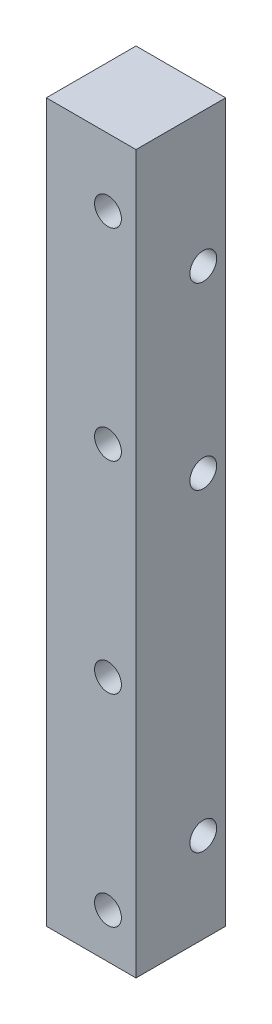
ISO-10303-21;
HEADER;
FILE_DESCRIPTION(('STEP AP214'),'2;1');
FILE_NAME('part.step','',(''),(''),'','','');
FILE_SCHEMA(('AUTOMOTIVE_DESIGN { 1 0 10303 214 1 1 1 1 }'));
ENDSEC;
DATA;
#1=APPLICATION_CONTEXT('core data for automotive mechanical design processes');
#2=APPLICATION_PROTOCOL_DEFINITION('international standard','automotive_design',2000,#1);
#3=PRODUCT_CONTEXT('',#1,'mechanical');
#4=PRODUCT('Part','Part','',(#3));
#5=PRODUCT_RELATED_PRODUCT_CATEGORY('part','',(#4));
#6=PRODUCT_DEFINITION_FORMATION('','',#4);
#7=PRODUCT_DEFINITION_CONTEXT('part definition',#1,'design');
#8=PRODUCT_DEFINITION('design','',#6,#7);
#9=PRODUCT_DEFINITION_SHAPE('','',#8);
#10=(LENGTH_UNIT() NAMED_UNIT(*) SI_UNIT(.MILLI.,.METRE.));
#11=(NAMED_UNIT(*) PLANE_ANGLE_UNIT() SI_UNIT($,.RADIAN.));
#12=(NAMED_UNIT(*) SI_UNIT($,.STERADIAN.) SOLID_ANGLE_UNIT());
#13=UNCERTAINTY_MEASURE_WITH_UNIT(LENGTH_MEASURE(1.E-05),#10,'distance_accuracy_value','');
#14=(GEOMETRIC_REPRESENTATION_CONTEXT(3) GLOBAL_UNCERTAINTY_ASSIGNED_CONTEXT((#13)) GLOBAL_UNIT_ASSIGNED_CONTEXT((#10,
#11,#12)) REPRESENTATION_CONTEXT('',''));
#15=CARTESIAN_POINT('',(0.,0.,0.));
#16=DIRECTION('',(0.,0.,1.));
#17=DIRECTION('',(1.,0.,0.));
#18=AXIS2_PLACEMENT_3D('',#15,#16,#17);
#19=CARTESIAN_POINT('',(6.35,101.6,-6.35));
#20=DIRECTION('',(-1.,0.,0.));
#21=DIRECTION('',(0.,0.,1.));
#22=AXIS2_PLACEMENT_3D('',#19,#20,#21);
#23=PLANE('',#22);
#24=CARTESIAN_POINT('',(6.35,12.7,-3.17500000000001));
#25=DIRECTION('',(1.,0.,0.));
#26=DIRECTION('',(0.,0.,-1.));
#27=AXIS2_PLACEMENT_3D('',#24,#25,#26);
#28=CIRCLE('',#27,1.89865);
#29=CARTESIAN_POINT('',(6.35,12.7,-5.07365000000001));
#30=VERTEX_POINT('',#29);
#31=EDGE_CURVE('E125',#30,#30,#28,.T.);
#32=ORIENTED_EDGE('',*,*,#31,.F.);
#33=EDGE_LOOP('',(#32));
#34=FACE_BOUND('',#33,.T.);
#35=CARTESIAN_POINT('',(6.35,57.15,-3.17500000000001));
#36=DIRECTION('',(1.,0.,0.));
#37=DIRECTION('',(0.,0.,-1.));
#38=AXIS2_PLACEMENT_3D('',#35,#36,#37);
#39=CIRCLE('',#38,1.89865);
#40=CARTESIAN_POINT('',(6.35,57.15,-5.07365000000001));
#41=VERTEX_POINT('',#40);
#42=EDGE_CURVE('E119',#41,#41,#39,.T.);
#43=ORIENTED_EDGE('',*,*,#42,.F.);
#44=EDGE_LOOP('',(#43));
#45=FACE_BOUND('',#44,.T.);
#46=CARTESIAN_POINT('',(6.35,82.55,-3.17500000000001));
#47=DIRECTION('',(1.,0.,0.));
#48=DIRECTION('',(0.,0.,-1.));
#49=AXIS2_PLACEMENT_3D('',#46,#47,#48);
#50=CIRCLE('',#49,1.89865);
#51=CARTESIAN_POINT('',(6.35,82.55,-5.07365000000001));
#52=VERTEX_POINT('',#51);
#53=EDGE_CURVE('E113',#52,#52,#50,.T.);
#54=ORIENTED_EDGE('',*,*,#53,.F.);
#55=EDGE_LOOP('',(#54));
#56=FACE_BOUND('',#55,.T.);
#57=DIRECTION('',(0.,0.,-1.));
#58=VECTOR('',#57,1.);
#59=CARTESIAN_POINT('',(6.35,0.,-6.35));
#60=LINE('',#59,#58);
#61=CARTESIAN_POINT('',(6.35,0.,6.35));
#62=VERTEX_POINT('',#61);
#63=CARTESIAN_POINT('',(6.35,0.,-6.35));
#64=VERTEX_POINT('',#63);
#65=EDGE_CURVE('E97',#62,#64,#60,.T.);
#66=ORIENTED_EDGE('',*,*,#65,.T.);
#67=DIRECTION('',(0.,-1.,0.));
#68=VECTOR('',#67,1.);
#69=CARTESIAN_POINT('',(6.35,101.6,-6.35));
#70=LINE('',#69,#68);
#71=CARTESIAN_POINT('',(6.35,101.6,-6.35));
#72=VERTEX_POINT('',#71);
#73=EDGE_CURVE('E11',#72,#64,#70,.T.);
#74=ORIENTED_EDGE('',*,*,#73,.F.);
#75=DIRECTION('',(0.,0.,-1.));
#76=VECTOR('',#75,1.);
#77=CARTESIAN_POINT('',(6.35,101.6,-6.35));
#78=LINE('',#77,#76);
#79=CARTESIAN_POINT('',(6.35,101.6,6.35));
#80=VERTEX_POINT('',#79);
#81=EDGE_CURVE('E85',#80,#72,#78,.T.);
#82=ORIENTED_EDGE('',*,*,#81,.F.);
#83=DIRECTION('',(0.,-1.,0.));
#84=VECTOR('',#83,1.);
#85=CARTESIAN_POINT('',(6.35,101.6,6.35));
#86=LINE('',#85,#84);
#87=EDGE_CURVE('E93',#80,#62,#86,.T.);
#88=ORIENTED_EDGE('',*,*,#87,.T.);
#89=EDGE_LOOP('',(#66,#74,#82,#88));
#90=FACE_BOUND('',#89,.T.);
#91=ADVANCED_FACE('F34',(#34,#45,#56,#90),#23,.F.);
#92=CARTESIAN_POINT('',(-6.35,101.6,-6.35));
#93=DIRECTION('',(0.,0.,1.));
#94=DIRECTION('',(1.,0.,0.));
#95=AXIS2_PLACEMENT_3D('',#92,#93,#94);
#96=PLANE('',#95);
#97=CARTESIAN_POINT('',(2.38125,6.35,-6.35));
#98=DIRECTION('',(0.,0.,1.));
#99=DIRECTION('',(1.,0.,0.));
#100=AXIS2_PLACEMENT_3D('',#97,#98,#99);
#101=CIRCLE('',#100,1.89865);
#102=CARTESIAN_POINT('',(4.2799,6.35,-6.35));
#103=VERTEX_POINT('',#102);
#104=EDGE_CURVE('E146',#103,#103,#101,.T.);
#105=ORIENTED_EDGE('',*,*,#104,.T.);
#106=EDGE_LOOP('',(#105));
#107=FACE_BOUND('',#106,.T.);
#108=CARTESIAN_POINT('',(2.38125,34.925,-6.35));
#109=DIRECTION('',(0.,0.,1.));
#110=DIRECTION('',(1.,0.,0.));
#111=AXIS2_PLACEMENT_3D('',#108,#109,#110);
#112=CIRCLE('',#111,1.89865);
#113=CARTESIAN_POINT('',(4.2799,34.925,-6.35));
#114=VERTEX_POINT('',#113);
#115=EDGE_CURVE('E140',#114,#114,#112,.T.);
#116=ORIENTED_EDGE('',*,*,#115,.T.);
#117=EDGE_LOOP('',(#116));
#118=FACE_BOUND('',#117,.T.);
#119=CARTESIAN_POINT('',(2.38125,63.5,-6.35));
#120=DIRECTION('',(0.,0.,1.));
#121=DIRECTION('',(1.,0.,0.));
#122=AXIS2_PLACEMENT_3D('',#119,#120,#121);
#123=CIRCLE('',#122,1.89865);
#124=CARTESIAN_POINT('',(4.2799,63.5,-6.35));
#125=VERTEX_POINT('',#124);
#126=EDGE_CURVE('E134',#125,#125,#123,.T.);
#127=ORIENTED_EDGE('',*,*,#126,.T.);
#128=EDGE_LOOP('',(#127));
#129=FACE_BOUND('',#128,.T.);
#130=CARTESIAN_POINT('',(2.38125,92.075,-6.35));
#131=DIRECTION('',(0.,0.,1.));
#132=DIRECTION('',(1.,0.,0.));
#133=AXIS2_PLACEMENT_3D('',#130,#131,#132);
#134=CIRCLE('',#133,1.89865);
#135=CARTESIAN_POINT('',(4.2799,92.075,-6.35));
#136=VERTEX_POINT('',#135);
#137=EDGE_CURVE('E128',#136,#136,#134,.T.);
#138=ORIENTED_EDGE('',*,*,#137,.T.);
#139=EDGE_LOOP('',(#138));
#140=FACE_BOUND('',#139,.T.);
#141=DIRECTION('',(-1.,0.,0.));
#142=VECTOR('',#141,1.);
#143=CARTESIAN_POINT('',(-6.35,0.,-6.35));
#144=LINE('',#143,#142);
#145=CARTESIAN_POINT('',(-6.35,0.,-6.35));
#146=VERTEX_POINT('',#145);
#147=EDGE_CURVE('E89',#64,#146,#144,.T.);
#148=ORIENTED_EDGE('',*,*,#147,.T.);
#149=DIRECTION('',(0.,-1.,0.));
#150=VECTOR('',#149,1.);
#151=CARTESIAN_POINT('',(-6.35,101.6,-6.35));
#152=LINE('',#151,#150);
#153=CARTESIAN_POINT('',(-6.35,101.6,-6.35));
#154=VERTEX_POINT('',#153);
#155=EDGE_CURVE('E42',#154,#146,#152,.T.);
#156=ORIENTED_EDGE('',*,*,#155,.F.);
#157=DIRECTION('',(-1.,0.,0.));
#158=VECTOR('',#157,1.);
#159=CARTESIAN_POINT('',(-6.35,101.6,-6.35));
#160=LINE('',#159,#158);
#161=EDGE_CURVE('E80',#72,#154,#160,.T.);
#162=ORIENTED_EDGE('',*,*,#161,.F.);
#163=ORIENTED_EDGE('',*,*,#73,.T.);
#164=EDGE_LOOP('',(#148,#156,#162,#163));
#165=FACE_BOUND('',#164,.T.);
#166=ADVANCED_FACE('F88',(#107,#118,#129,#140,#165),#96,.F.);
#167=CARTESIAN_POINT('',(-6.35,101.6,-6.35));
#168=DIRECTION('',(1.,0.,0.));
#169=DIRECTION('',(0.,0.,-1.));
#170=AXIS2_PLACEMENT_3D('',#167,#168,#169);
#171=PLANE('',#170);
#172=CARTESIAN_POINT('',(-6.35,12.7,-3.17500000000001));
#173=DIRECTION('',(1.,0.,0.));
#174=DIRECTION('',(0.,0.,-1.));
#175=AXIS2_PLACEMENT_3D('',#172,#173,#174);
#176=CIRCLE('',#175,1.89865);
#177=CARTESIAN_POINT('',(-6.35,12.7,-5.07365));
#178=VERTEX_POINT('',#177);
#179=EDGE_CURVE('E122',#178,#178,#176,.T.);
#180=ORIENTED_EDGE('',*,*,#179,.T.);
#181=EDGE_LOOP('',(#180));
#182=FACE_BOUND('',#181,.T.);
#183=CARTESIAN_POINT('',(-6.35,57.15,-3.17500000000001));
#184=DIRECTION('',(1.,0.,0.));
#185=DIRECTION('',(0.,0.,-1.));
#186=AXIS2_PLACEMENT_3D('',#183,#184,#185);
#187=CIRCLE('',#186,1.89864999999999);
#188=CARTESIAN_POINT('',(-6.35,57.15,-5.07365));
#189=VERTEX_POINT('',#188);
#190=EDGE_CURVE('E116',#189,#189,#187,.T.);
#191=ORIENTED_EDGE('',*,*,#190,.T.);
#192=EDGE_LOOP('',(#191));
#193=FACE_BOUND('',#192,.T.);
#194=CARTESIAN_POINT('',(-6.35,82.55,-3.17500000000001));
#195=DIRECTION('',(1.,0.,0.));
#196=DIRECTION('',(0.,0.,-1.));
#197=AXIS2_PLACEMENT_3D('',#194,#195,#196);
#198=CIRCLE('',#197,1.89865);
#199=CARTESIAN_POINT('',(-6.35,82.55,-5.07365000000001));
#200=VERTEX_POINT('',#199);
#201=EDGE_CURVE('E100',#200,#200,#198,.T.);
#202=ORIENTED_EDGE('',*,*,#201,.T.);
#203=EDGE_LOOP('',(#202));
#204=FACE_BOUND('',#203,.T.);
#205=DIRECTION('',(0.,0.,1.));
#206=VECTOR('',#205,1.);
#207=CARTESIAN_POINT('',(-6.35,0.,-6.35));
#208=LINE('',#207,#206);
#209=CARTESIAN_POINT('',(-6.35,0.,6.35));
#210=VERTEX_POINT('',#209);
#211=EDGE_CURVE('E67',#146,#210,#208,.T.);
#212=ORIENTED_EDGE('',*,*,#211,.T.);
#213=DIRECTION('',(0.,-1.,0.));
#214=VECTOR('',#213,1.);
#215=CARTESIAN_POINT('',(-6.35,101.6,6.35));
#216=LINE('',#215,#214);
#217=CARTESIAN_POINT('',(-6.35,101.6,6.35));
#218=VERTEX_POINT('',#217);
#219=EDGE_CURVE('E90',#218,#210,#216,.T.);
#220=ORIENTED_EDGE('',*,*,#219,.F.);
#221=DIRECTION('',(0.,0.,1.));
#222=VECTOR('',#221,1.);
#223=CARTESIAN_POINT('',(-6.35,101.6,-6.35));
#224=LINE('',#223,#222);
#225=EDGE_CURVE('E83',#154,#218,#224,.T.);
#226=ORIENTED_EDGE('',*,*,#225,.F.);
#227=ORIENTED_EDGE('',*,*,#155,.T.);
#228=EDGE_LOOP('',(#212,#220,#226,#227));
#229=FACE_BOUND('',#228,.T.);
#230=ADVANCED_FACE('F91',(#182,#193,#204,#229),#171,.F.);
#231=CARTESIAN_POINT('',(-6.35,101.6,6.35));
#232=DIRECTION('',(0.,0.,-1.));
#233=DIRECTION('',(-1.,0.,0.));
#234=AXIS2_PLACEMENT_3D('',#231,#232,#233);
#235=PLANE('',#234);
#236=CARTESIAN_POINT('',(2.38125,6.35,6.35));
#237=DIRECTION('',(0.,0.,1.));
#238=DIRECTION('',(1.,0.,0.));
#239=AXIS2_PLACEMENT_3D('',#236,#237,#238);
#240=CIRCLE('',#239,1.89865);
#241=CARTESIAN_POINT('',(4.2799,6.35,6.35));
#242=VERTEX_POINT('',#241);
#243=EDGE_CURVE('E149',#242,#242,#240,.T.);
#244=ORIENTED_EDGE('',*,*,#243,.F.);
#245=EDGE_LOOP('',(#244));
#246=FACE_BOUND('',#245,.T.);
#247=CARTESIAN_POINT('',(2.38125,34.925,6.35));
#248=DIRECTION('',(0.,0.,1.));
#249=DIRECTION('',(1.,0.,0.));
#250=AXIS2_PLACEMENT_3D('',#247,#248,#249);
#251=CIRCLE('',#250,1.89865);
#252=CARTESIAN_POINT('',(4.2799,34.925,6.35));
#253=VERTEX_POINT('',#252);
#254=EDGE_CURVE('E143',#253,#253,#251,.T.);
#255=ORIENTED_EDGE('',*,*,#254,.F.);
#256=EDGE_LOOP('',(#255));
#257=FACE_BOUND('',#256,.T.);
#258=CARTESIAN_POINT('',(2.38125,63.5,6.35));
#259=DIRECTION('',(0.,0.,1.));
#260=DIRECTION('',(1.,0.,0.));
#261=AXIS2_PLACEMENT_3D('',#258,#259,#260);
#262=CIRCLE('',#261,1.89865);
#263=CARTESIAN_POINT('',(4.2799,63.5,6.35));
#264=VERTEX_POINT('',#263);
#265=EDGE_CURVE('E137',#264,#264,#262,.T.);
#266=ORIENTED_EDGE('',*,*,#265,.F.);
#267=EDGE_LOOP('',(#266));
#268=FACE_BOUND('',#267,.T.);
#269=CARTESIAN_POINT('',(2.38125,92.075,6.35));
#270=DIRECTION('',(0.,0.,1.));
#271=DIRECTION('',(1.,0.,0.));
#272=AXIS2_PLACEMENT_3D('',#269,#270,#271);
#273=CIRCLE('',#272,1.89865);
#274=CARTESIAN_POINT('',(4.2799,92.075,6.35));
#275=VERTEX_POINT('',#274);
#276=EDGE_CURVE('E131',#275,#275,#273,.T.);
#277=ORIENTED_EDGE('',*,*,#276,.F.);
#278=EDGE_LOOP('',(#277));
#279=FACE_BOUND('',#278,.T.);
#280=DIRECTION('',(1.,0.,0.));
#281=VECTOR('',#280,1.);
#282=CARTESIAN_POINT('',(-6.35,0.,6.35));
#283=LINE('',#282,#281);
#284=EDGE_CURVE('E73',#210,#62,#283,.T.);
#285=ORIENTED_EDGE('',*,*,#284,.T.);
#286=ORIENTED_EDGE('',*,*,#87,.F.);
#287=DIRECTION('',(1.,0.,0.));
#288=VECTOR('',#287,1.);
#289=CARTESIAN_POINT('',(-6.35,101.6,6.35));
#290=LINE('',#289,#288);
#291=EDGE_CURVE('E50',#218,#80,#290,.T.);
#292=ORIENTED_EDGE('',*,*,#291,.F.);
#293=ORIENTED_EDGE('',*,*,#219,.T.);
#294=EDGE_LOOP('',(#285,#286,#292,#293));
#295=FACE_BOUND('',#294,.T.);
#296=ADVANCED_FACE('F105',(#246,#257,#268,#279,#295),#235,.F.);
#297=CARTESIAN_POINT('',(0.,101.6,0.));
#298=DIRECTION('',(0.,1.,0.));
#299=DIRECTION('',(0.,0.,1.));
#300=AXIS2_PLACEMENT_3D('',#297,#298,#299);
#301=PLANE('',#300);
#302=ORIENTED_EDGE('',*,*,#81,.T.);
#303=ORIENTED_EDGE('',*,*,#161,.T.);
#304=ORIENTED_EDGE('',*,*,#225,.T.);
#305=ORIENTED_EDGE('',*,*,#291,.T.);
#306=EDGE_LOOP('',(#302,#303,#304,#305));
#307=FACE_BOUND('',#306,.T.);
#308=ADVANCED_FACE('F81',(#307),#301,.T.);
#309=CARTESIAN_POINT('',(0.,0.,0.));
#310=DIRECTION('',(0.,1.,0.));
#311=DIRECTION('',(0.,0.,1.));
#312=AXIS2_PLACEMENT_3D('',#309,#310,#311);
#313=PLANE('',#312);
#314=ORIENTED_EDGE('',*,*,#65,.F.);
#315=ORIENTED_EDGE('',*,*,#284,.F.);
#316=ORIENTED_EDGE('',*,*,#211,.F.);
#317=ORIENTED_EDGE('',*,*,#147,.F.);
#318=EDGE_LOOP('',(#314,#315,#316,#317));
#319=FACE_BOUND('',#318,.T.);
#320=ADVANCED_FACE('F108',(#319),#313,.F.);
#321=CARTESIAN_POINT('',(6.35,82.55,-3.17500000000001));
#322=DIRECTION('',(1.,0.,0.));
#323=DIRECTION('',(0.,0.,-1.));
#324=AXIS2_PLACEMENT_3D('',#321,#322,#323);
#325=CYLINDRICAL_SURFACE('',#324,1.89865);
#326=ORIENTED_EDGE('',*,*,#201,.F.);
#327=EDGE_LOOP('',(#326));
#328=FACE_BOUND('',#327,.T.);
#329=ORIENTED_EDGE('',*,*,#53,.T.);
#330=EDGE_LOOP('',(#329));
#331=FACE_BOUND('',#330,.T.);
#332=ADVANCED_FACE('F193',(#328,#331),#325,.F.);
#333=CARTESIAN_POINT('',(6.35,57.15,-3.17500000000001));
#334=DIRECTION('',(1.,0.,0.));
#335=DIRECTION('',(0.,0.,-1.));
#336=AXIS2_PLACEMENT_3D('',#333,#334,#335);
#337=CYLINDRICAL_SURFACE('',#336,1.89865);
#338=ORIENTED_EDGE('',*,*,#190,.F.);
#339=EDGE_LOOP('',(#338));
#340=FACE_BOUND('',#339,.T.);
#341=ORIENTED_EDGE('',*,*,#42,.T.);
#342=EDGE_LOOP('',(#341));
#343=FACE_BOUND('',#342,.T.);
#344=ADVANCED_FACE('F177',(#340,#343),#337,.F.);
#345=CARTESIAN_POINT('',(6.35,12.7,-3.17500000000001));
#346=DIRECTION('',(1.,0.,0.));
#347=DIRECTION('',(0.,0.,-1.));
#348=AXIS2_PLACEMENT_3D('',#345,#346,#347);
#349=CYLINDRICAL_SURFACE('',#348,1.89865);
#350=ORIENTED_EDGE('',*,*,#179,.F.);
#351=EDGE_LOOP('',(#350));
#352=FACE_BOUND('',#351,.T.);
#353=ORIENTED_EDGE('',*,*,#31,.T.);
#354=EDGE_LOOP('',(#353));
#355=FACE_BOUND('',#354,.T.);
#356=ADVANCED_FACE('F167',(#352,#355),#349,.F.);
#357=CARTESIAN_POINT('',(2.38125,92.075,6.35));
#358=DIRECTION('',(0.,0.,1.));
#359=DIRECTION('',(1.,0.,0.));
#360=AXIS2_PLACEMENT_3D('',#357,#358,#359);
#361=CYLINDRICAL_SURFACE('',#360,1.89865);
#362=ORIENTED_EDGE('',*,*,#137,.F.);
#363=EDGE_LOOP('',(#362));
#364=FACE_BOUND('',#363,.T.);
#365=ORIENTED_EDGE('',*,*,#276,.T.);
#366=EDGE_LOOP('',(#365));
#367=FACE_BOUND('',#366,.T.);
#368=ADVANCED_FACE('F164',(#364,#367),#361,.F.);
#369=CARTESIAN_POINT('',(2.38125,63.5,6.35));
#370=DIRECTION('',(0.,0.,1.));
#371=DIRECTION('',(1.,0.,0.));
#372=AXIS2_PLACEMENT_3D('',#369,#370,#371);
#373=CYLINDRICAL_SURFACE('',#372,1.89865);
#374=ORIENTED_EDGE('',*,*,#126,.F.);
#375=EDGE_LOOP('',(#374));
#376=FACE_BOUND('',#375,.T.);
#377=ORIENTED_EDGE('',*,*,#265,.T.);
#378=EDGE_LOOP('',(#377));
#379=FACE_BOUND('',#378,.T.);
#380=ADVANCED_FACE('F166',(#376,#379),#373,.F.);
#381=CARTESIAN_POINT('',(2.38125,34.925,6.35));
#382=DIRECTION('',(0.,0.,1.));
#383=DIRECTION('',(1.,0.,0.));
#384=AXIS2_PLACEMENT_3D('',#381,#382,#383);
#385=CYLINDRICAL_SURFACE('',#384,1.89865);
#386=ORIENTED_EDGE('',*,*,#115,.F.);
#387=EDGE_LOOP('',(#386));
#388=FACE_BOUND('',#387,.T.);
#389=ORIENTED_EDGE('',*,*,#254,.T.);
#390=EDGE_LOOP('',(#389));
#391=FACE_BOUND('',#390,.T.);
#392=ADVANCED_FACE('F174',(#388,#391),#385,.F.);
#393=CARTESIAN_POINT('',(2.38125,6.35,6.35));
#394=DIRECTION('',(0.,0.,1.));
#395=DIRECTION('',(1.,0.,0.));
#396=AXIS2_PLACEMENT_3D('',#393,#394,#395);
#397=CYLINDRICAL_SURFACE('',#396,1.89865);
#398=ORIENTED_EDGE('',*,*,#104,.F.);
#399=EDGE_LOOP('',(#398));
#400=FACE_BOUND('',#399,.T.);
#401=ORIENTED_EDGE('',*,*,#243,.T.);
#402=EDGE_LOOP('',(#401));
#403=FACE_BOUND('',#402,.T.);
#404=ADVANCED_FACE('F153',(#400,#403),#397,.F.);
#405=CLOSED_SHELL('',(#91,#166,#230,#296,#308,#320,#332,#344,#356,#368,#380,#392,#404));
#406=MANIFOLD_SOLID_BREP('B2',#405);
#407=ADVANCED_BREP_SHAPE_REPRESENTATION('',(#18,#406),#14);
#408=SHAPE_DEFINITION_REPRESENTATION(#9,#407);
ENDSEC;
END-ISO-10303-21;
